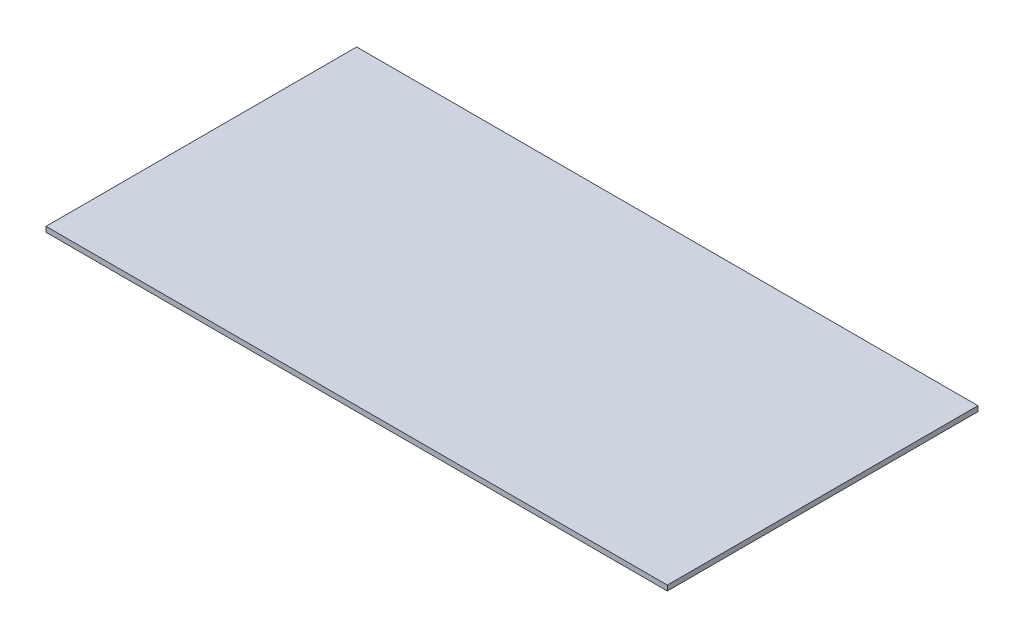
ISO-10303-21;
HEADER;
FILE_DESCRIPTION(('STEP AP214'),'2;1');
FILE_NAME('part.step','',(''),(''),'','','');
FILE_SCHEMA(('AUTOMOTIVE_DESIGN { 1 0 10303 214 1 1 1 1 }'));
ENDSEC;
DATA;
#1=APPLICATION_CONTEXT('core data for automotive mechanical design processes');
#2=APPLICATION_PROTOCOL_DEFINITION('international standard','automotive_design',2000,#1);
#3=PRODUCT_CONTEXT('',#1,'mechanical');
#4=PRODUCT('Part','Part','',(#3));
#5=PRODUCT_RELATED_PRODUCT_CATEGORY('part','',(#4));
#6=PRODUCT_DEFINITION_FORMATION('','',#4);
#7=PRODUCT_DEFINITION_CONTEXT('part definition',#1,'design');
#8=PRODUCT_DEFINITION('design','',#6,#7);
#9=PRODUCT_DEFINITION_SHAPE('','',#8);
#10=(LENGTH_UNIT() NAMED_UNIT(*) SI_UNIT(.MILLI.,.METRE.));
#11=(NAMED_UNIT(*) PLANE_ANGLE_UNIT() SI_UNIT($,.RADIAN.));
#12=(NAMED_UNIT(*) SI_UNIT($,.STERADIAN.) SOLID_ANGLE_UNIT());
#13=UNCERTAINTY_MEASURE_WITH_UNIT(LENGTH_MEASURE(1.E-05),#10,'distance_accuracy_value','');
#14=(GEOMETRIC_REPRESENTATION_CONTEXT(3) GLOBAL_UNCERTAINTY_ASSIGNED_CONTEXT((#13)) GLOBAL_UNIT_ASSIGNED_CONTEXT((#10,
#11,#12)) REPRESENTATION_CONTEXT('',''));
#15=CARTESIAN_POINT('',(0.,0.,0.));
#16=DIRECTION('',(0.,0.,1.));
#17=DIRECTION('',(1.,0.,0.));
#18=AXIS2_PLACEMENT_3D('',#15,#16,#17);
#19=CARTESIAN_POINT('',(-1500.,25.,-750.));
#20=DIRECTION('',(1.,0.,0.));
#21=DIRECTION('',(0.,0.,-1.));
#22=AXIS2_PLACEMENT_3D('',#19,#20,#21);
#23=PLANE('',#22);
#24=DIRECTION('',(0.,0.,1.));
#25=VECTOR('',#24,1.);
#26=CARTESIAN_POINT('',(-1500.,0.,-750.));
#27=LINE('',#26,#25);
#28=CARTESIAN_POINT('',(-1500.,0.,-750.));
#29=VERTEX_POINT('',#28);
#30=CARTESIAN_POINT('',(-1500.,0.,750.));
#31=VERTEX_POINT('',#30);
#32=EDGE_CURVE('E96',#29,#31,#27,.T.);
#33=ORIENTED_EDGE('',*,*,#32,.T.);
#34=DIRECTION('',(0.,-1.,0.));
#35=VECTOR('',#34,1.);
#36=CARTESIAN_POINT('',(-1500.,25.,750.));
#37=LINE('',#36,#35);
#38=CARTESIAN_POINT('',(-1500.,25.,750.));
#39=VERTEX_POINT('',#38);
#40=EDGE_CURVE('E11',#39,#31,#37,.T.);
#41=ORIENTED_EDGE('',*,*,#40,.F.);
#42=DIRECTION('',(0.,0.,1.));
#43=VECTOR('',#42,1.);
#44=CARTESIAN_POINT('',(-1500.,25.,-750.));
#45=LINE('',#44,#43);
#46=CARTESIAN_POINT('',(-1500.,25.,-750.));
#47=VERTEX_POINT('',#46);
#48=EDGE_CURVE('E84',#47,#39,#45,.T.);
#49=ORIENTED_EDGE('',*,*,#48,.F.);
#50=DIRECTION('',(0.,-1.,0.));
#51=VECTOR('',#50,1.);
#52=CARTESIAN_POINT('',(-1500.,25.,-750.));
#53=LINE('',#52,#51);
#54=EDGE_CURVE('E92',#47,#29,#53,.T.);
#55=ORIENTED_EDGE('',*,*,#54,.T.);
#56=EDGE_LOOP('',(#33,#41,#49,#55));
#57=FACE_BOUND('',#56,.T.);
#58=ADVANCED_FACE('F33',(#57),#23,.F.);
#59=CARTESIAN_POINT('',(1500.,25.,750.));
#60=DIRECTION('',(0.,0.,-1.));
#61=DIRECTION('',(-1.,0.,0.));
#62=AXIS2_PLACEMENT_3D('',#59,#60,#61);
#63=PLANE('',#62);
#64=DIRECTION('',(1.,0.,0.));
#65=VECTOR('',#64,1.);
#66=CARTESIAN_POINT('',(1500.,0.,750.));
#67=LINE('',#66,#65);
#68=CARTESIAN_POINT('',(1500.,0.,750.));
#69=VERTEX_POINT('',#68);
#70=EDGE_CURVE('E88',#31,#69,#67,.T.);
#71=ORIENTED_EDGE('',*,*,#70,.T.);
#72=DIRECTION('',(0.,-1.,0.));
#73=VECTOR('',#72,1.);
#74=CARTESIAN_POINT('',(1500.,25.,750.));
#75=LINE('',#74,#73);
#76=CARTESIAN_POINT('',(1500.,25.,750.));
#77=VERTEX_POINT('',#76);
#78=EDGE_CURVE('E41',#77,#69,#75,.T.);
#79=ORIENTED_EDGE('',*,*,#78,.F.);
#80=DIRECTION('',(1.,0.,0.));
#81=VECTOR('',#80,1.);
#82=CARTESIAN_POINT('',(1500.,25.,750.));
#83=LINE('',#82,#81);
#84=EDGE_CURVE('E79',#39,#77,#83,.T.);
#85=ORIENTED_EDGE('',*,*,#84,.F.);
#86=ORIENTED_EDGE('',*,*,#40,.T.);
#87=EDGE_LOOP('',(#71,#79,#85,#86));
#88=FACE_BOUND('',#87,.T.);
#89=ADVANCED_FACE('F87',(#88),#63,.F.);
#90=CARTESIAN_POINT('',(1500.,25.,-750.));
#91=DIRECTION('',(-1.,0.,0.));
#92=DIRECTION('',(0.,0.,1.));
#93=AXIS2_PLACEMENT_3D('',#90,#91,#92);
#94=PLANE('',#93);
#95=DIRECTION('',(0.,0.,-1.));
#96=VECTOR('',#95,1.);
#97=CARTESIAN_POINT('',(1500.,0.,-750.));
#98=LINE('',#97,#96);
#99=CARTESIAN_POINT('',(1500.,0.,-750.));
#100=VERTEX_POINT('',#99);
#101=EDGE_CURVE('E66',#69,#100,#98,.T.);
#102=ORIENTED_EDGE('',*,*,#101,.T.);
#103=DIRECTION('',(0.,-1.,0.));
#104=VECTOR('',#103,1.);
#105=CARTESIAN_POINT('',(1500.,25.,-750.));
#106=LINE('',#105,#104);
#107=CARTESIAN_POINT('',(1500.,25.,-750.));
#108=VERTEX_POINT('',#107);
#109=EDGE_CURVE('E89',#108,#100,#106,.T.);
#110=ORIENTED_EDGE('',*,*,#109,.F.);
#111=DIRECTION('',(0.,0.,-1.));
#112=VECTOR('',#111,1.);
#113=CARTESIAN_POINT('',(1500.,25.,-750.));
#114=LINE('',#113,#112);
#115=EDGE_CURVE('E82',#77,#108,#114,.T.);
#116=ORIENTED_EDGE('',*,*,#115,.F.);
#117=ORIENTED_EDGE('',*,*,#78,.T.);
#118=EDGE_LOOP('',(#102,#110,#116,#117));
#119=FACE_BOUND('',#118,.T.);
#120=ADVANCED_FACE('F90',(#119),#94,.F.);
#121=CARTESIAN_POINT('',(1500.,25.,-750.));
#122=DIRECTION('',(0.,0.,1.));
#123=DIRECTION('',(1.,0.,0.));
#124=AXIS2_PLACEMENT_3D('',#121,#122,#123);
#125=PLANE('',#124);
#126=DIRECTION('',(-1.,0.,0.));
#127=VECTOR('',#126,1.);
#128=CARTESIAN_POINT('',(1500.,0.,-750.));
#129=LINE('',#128,#127);
#130=EDGE_CURVE('E72',#100,#29,#129,.T.);
#131=ORIENTED_EDGE('',*,*,#130,.T.);
#132=ORIENTED_EDGE('',*,*,#54,.F.);
#133=DIRECTION('',(-1.,0.,0.));
#134=VECTOR('',#133,1.);
#135=CARTESIAN_POINT('',(1500.,25.,-750.));
#136=LINE('',#135,#134);
#137=EDGE_CURVE('E49',#108,#47,#136,.T.);
#138=ORIENTED_EDGE('',*,*,#137,.F.);
#139=ORIENTED_EDGE('',*,*,#109,.T.);
#140=EDGE_LOOP('',(#131,#132,#138,#139));
#141=FACE_BOUND('',#140,.T.);
#142=ADVANCED_FACE('F103',(#141),#125,.F.);
#143=CARTESIAN_POINT('',(0.,25.,0.));
#144=DIRECTION('',(0.,-1.,0.));
#145=DIRECTION('',(0.,0.,-1.));
#146=AXIS2_PLACEMENT_3D('',#143,#144,#145);
#147=PLANE('',#146);
#148=ORIENTED_EDGE('',*,*,#48,.T.);
#149=ORIENTED_EDGE('',*,*,#84,.T.);
#150=ORIENTED_EDGE('',*,*,#115,.T.);
#151=ORIENTED_EDGE('',*,*,#137,.T.);
#152=EDGE_LOOP('',(#148,#149,#150,#151));
#153=FACE_BOUND('',#152,.T.);
#154=ADVANCED_FACE('F80',(#153),#147,.F.);
#155=CARTESIAN_POINT('',(0.,0.,0.));
#156=DIRECTION('',(0.,-1.,0.));
#157=DIRECTION('',(0.,0.,-1.));
#158=AXIS2_PLACEMENT_3D('',#155,#156,#157);
#159=PLANE('',#158);
#160=ORIENTED_EDGE('',*,*,#32,.F.);
#161=ORIENTED_EDGE('',*,*,#130,.F.);
#162=ORIENTED_EDGE('',*,*,#101,.F.);
#163=ORIENTED_EDGE('',*,*,#70,.F.);
#164=EDGE_LOOP('',(#160,#161,#162,#163));
#165=FACE_BOUND('',#164,.T.);
#166=ADVANCED_FACE('F106',(#165),#159,.T.);
#167=CLOSED_SHELL('',(#58,#89,#120,#142,#154,#166));
#168=MANIFOLD_SOLID_BREP('B2',#167);
#169=ADVANCED_BREP_SHAPE_REPRESENTATION('',(#18,#168),#14);
#170=SHAPE_DEFINITION_REPRESENTATION(#9,#169);
ENDSEC;
END-ISO-10303-21;
